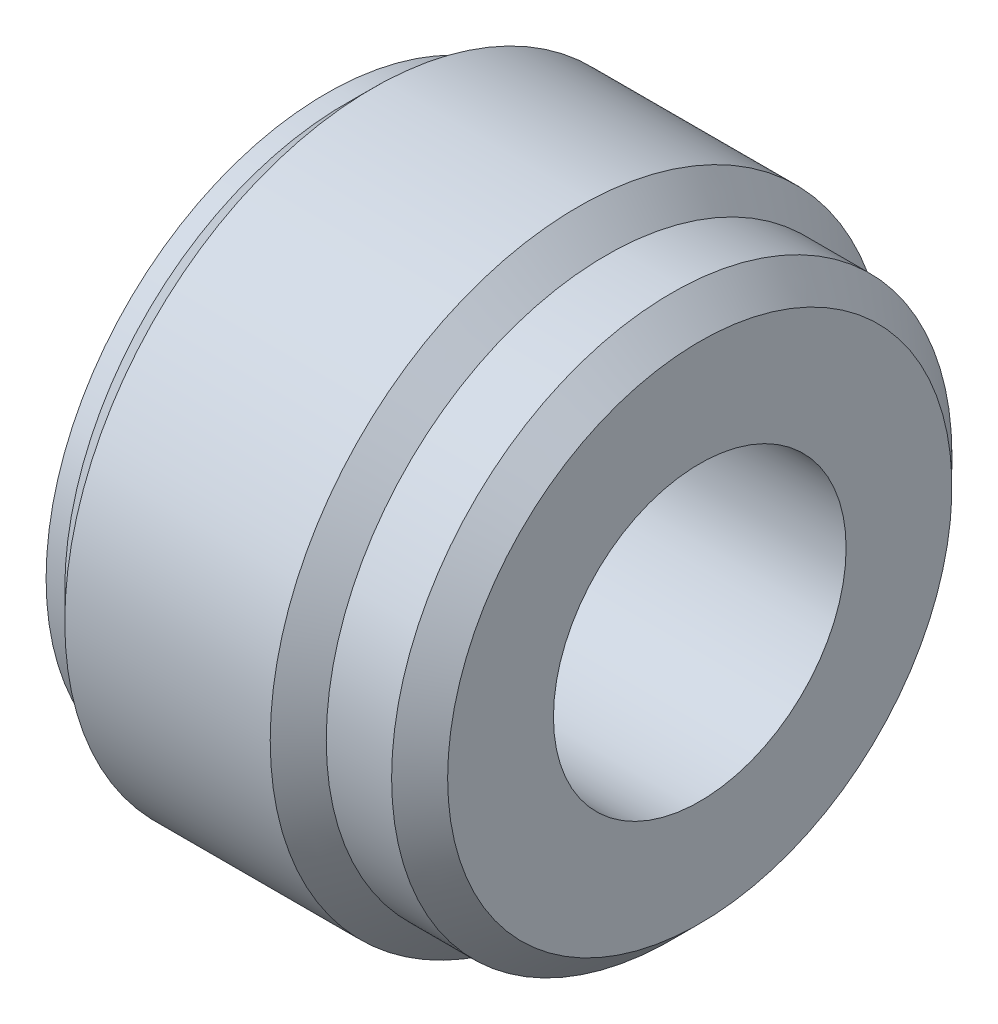
ISO-10303-21;
HEADER;
FILE_DESCRIPTION(('STEP AP214'),'2;1');
FILE_NAME('part.step','',(''),(''),'','','');
FILE_SCHEMA(('AUTOMOTIVE_DESIGN { 1 0 10303 214 1 1 1 1 }'));
ENDSEC;
DATA;
#1=APPLICATION_CONTEXT('core data for automotive mechanical design processes');
#2=APPLICATION_PROTOCOL_DEFINITION('international standard','automotive_design',2000,#1);
#3=PRODUCT_CONTEXT('',#1,'mechanical');
#4=PRODUCT('Part','Part','',(#3));
#5=PRODUCT_RELATED_PRODUCT_CATEGORY('part','',(#4));
#6=PRODUCT_DEFINITION_FORMATION('','',#4);
#7=PRODUCT_DEFINITION_CONTEXT('part definition',#1,'design');
#8=PRODUCT_DEFINITION('design','',#6,#7);
#9=PRODUCT_DEFINITION_SHAPE('','',#8);
#10=(LENGTH_UNIT() NAMED_UNIT(*) SI_UNIT(.MILLI.,.METRE.));
#11=(NAMED_UNIT(*) PLANE_ANGLE_UNIT() SI_UNIT($,.RADIAN.));
#12=(NAMED_UNIT(*) SI_UNIT($,.STERADIAN.) SOLID_ANGLE_UNIT());
#13=UNCERTAINTY_MEASURE_WITH_UNIT(LENGTH_MEASURE(1.E-05),#10,'distance_accuracy_value','');
#14=(GEOMETRIC_REPRESENTATION_CONTEXT(3) GLOBAL_UNCERTAINTY_ASSIGNED_CONTEXT((#13)) GLOBAL_UNIT_ASSIGNED_CONTEXT((#10,
#11,#12)) REPRESENTATION_CONTEXT('',''));
#15=CARTESIAN_POINT('',(0.,0.,0.));
#16=DIRECTION('',(0.,0.,1.));
#17=DIRECTION('',(1.,0.,0.));
#18=AXIS2_PLACEMENT_3D('',#15,#16,#17);
#19=CARTESIAN_POINT('',(0.,0.,0.));
#20=DIRECTION('',(1.,0.,0.));
#21=DIRECTION('',(0.,0.,-1.));
#22=AXIS2_PLACEMENT_3D('',#19,#20,#21);
#23=PLANE('',#22);
#24=CARTESIAN_POINT('',(0.,0.,0.));
#25=DIRECTION('',(-1.,0.,0.));
#26=DIRECTION('',(0.,0.,1.));
#27=AXIS2_PLACEMENT_3D('',#24,#25,#26);
#28=CIRCLE('',#27,0.7835);
#29=CARTESIAN_POINT('',(0.,0.,0.7835));
#30=VERTEX_POINT('',#29);
#31=EDGE_CURVE('E70',#30,#30,#28,.T.);
#32=ORIENTED_EDGE('',*,*,#31,.F.);
#33=EDGE_LOOP('',(#32));
#34=FACE_BOUND('',#33,.T.);
#35=CARTESIAN_POINT('',(0.,0.,0.));
#36=DIRECTION('',(-1.,0.,0.));
#37=DIRECTION('',(0.,0.,1.));
#38=AXIS2_PLACEMENT_3D('',#35,#36,#37);
#39=CIRCLE('',#38,1.5);
#40=CARTESIAN_POINT('',(0.,0.,1.5));
#41=VERTEX_POINT('',#40);
#42=EDGE_CURVE('E58',#41,#41,#39,.T.);
#43=ORIENTED_EDGE('',*,*,#42,.T.);
#44=EDGE_LOOP('',(#43));
#45=FACE_BOUND('',#44,.T.);
#46=ADVANCED_FACE('F38',(#34,#45),#23,.F.);
#47=CARTESIAN_POINT('',(-87.49,0.,0.));
#48=DIRECTION('',(-1.,0.,0.));
#49=DIRECTION('',(0.,0.,1.));
#50=AXIS2_PLACEMENT_3D('',#47,#48,#49);
#51=CYLINDRICAL_SURFACE('',#50,1.5);
#52=ORIENTED_EDGE('',*,*,#42,.F.);
#53=EDGE_LOOP('',(#52));
#54=FACE_BOUND('',#53,.T.);
#55=CARTESIAN_POINT('',(0.100000000000003,0.,0.));
#56=DIRECTION('',(-1.,0.,0.));
#57=DIRECTION('',(0.,0.,1.));
#58=AXIS2_PLACEMENT_3D('',#55,#56,#57);
#59=CIRCLE('',#58,1.5);
#60=CARTESIAN_POINT('',(0.100000000000003,0.,1.5));
#61=VERTEX_POINT('',#60);
#62=EDGE_CURVE('E61',#61,#61,#59,.T.);
#63=ORIENTED_EDGE('',*,*,#62,.T.);
#64=EDGE_LOOP('',(#63));
#65=FACE_BOUND('',#64,.T.);
#66=ADVANCED_FACE('F78',(#54,#65),#51,.T.);
#67=CARTESIAN_POINT('',(-87.49,0.,0.));
#68=DIRECTION('',(-1.,0.,0.));
#69=DIRECTION('',(0.,0.,1.));
#70=AXIS2_PLACEMENT_3D('',#67,#68,#69);
#71=CYLINDRICAL_SURFACE('',#70,1.65);
#72=CARTESIAN_POINT('',(1.35,0.,0.));
#73=DIRECTION('',(-1.,0.,0.));
#74=DIRECTION('',(0.,0.,1.));
#75=AXIS2_PLACEMENT_3D('',#72,#73,#74);
#76=CIRCLE('',#75,1.65);
#77=CARTESIAN_POINT('',(1.35,0.,1.65));
#78=VERTEX_POINT('',#77);
#79=EDGE_CURVE('E10',#78,#78,#76,.T.);
#80=ORIENTED_EDGE('',*,*,#79,.T.);
#81=EDGE_LOOP('',(#80));
#82=FACE_BOUND('',#81,.T.);
#83=CARTESIAN_POINT('',(0.25,0.,0.));
#84=DIRECTION('',(1.,0.,0.));
#85=DIRECTION('',(0.,0.,-1.));
#86=AXIS2_PLACEMENT_3D('',#83,#84,#85);
#87=CIRCLE('',#86,1.65);
#88=CARTESIAN_POINT('',(0.25,0.,-1.65));
#89=VERTEX_POINT('',#88);
#90=EDGE_CURVE('E45',#89,#89,#87,.T.);
#91=ORIENTED_EDGE('',*,*,#90,.T.);
#92=EDGE_LOOP('',(#91));
#93=FACE_BOUND('',#92,.T.);
#94=ADVANCED_FACE('F84',(#82,#93),#71,.T.);
#95=CARTESIAN_POINT('',(-87.49,0.,0.));
#96=DIRECTION('',(-1.,0.,0.));
#97=DIRECTION('',(0.,0.,1.));
#98=AXIS2_PLACEMENT_3D('',#95,#96,#97);
#99=CYLINDRICAL_SURFACE('',#98,1.5);
#100=CARTESIAN_POINT('',(1.85,0.,0.));
#101=DIRECTION('',(-1.,0.,0.));
#102=DIRECTION('',(0.,0.,1.));
#103=AXIS2_PLACEMENT_3D('',#100,#101,#102);
#104=CIRCLE('',#103,1.5);
#105=CARTESIAN_POINT('',(1.85,0.,1.5));
#106=VERTEX_POINT('',#105);
#107=EDGE_CURVE('E53',#106,#106,#104,.T.);
#108=ORIENTED_EDGE('',*,*,#107,.T.);
#109=EDGE_LOOP('',(#108));
#110=FACE_BOUND('',#109,.T.);
#111=CARTESIAN_POINT('',(1.5,0.,0.));
#112=DIRECTION('',(-1.,0.,0.));
#113=DIRECTION('',(0.,0.,1.));
#114=AXIS2_PLACEMENT_3D('',#111,#112,#113);
#115=CIRCLE('',#114,1.5);
#116=CARTESIAN_POINT('',(1.5,0.,1.5));
#117=VERTEX_POINT('',#116);
#118=EDGE_CURVE('E64',#117,#117,#115,.T.);
#119=ORIENTED_EDGE('',*,*,#118,.F.);
#120=EDGE_LOOP('',(#119));
#121=FACE_BOUND('',#120,.T.);
#122=ADVANCED_FACE('F105',(#110,#121),#99,.T.);
#123=CARTESIAN_POINT('',(2.,1.5,0.));
#124=DIRECTION('',(-1.,0.,0.));
#125=DIRECTION('',(0.,0.,1.));
#126=AXIS2_PLACEMENT_3D('',#123,#124,#125);
#127=PLANE('',#126);
#128=CARTESIAN_POINT('',(2.,0.,0.));
#129=DIRECTION('',(-1.,0.,0.));
#130=DIRECTION('',(0.,0.,1.));
#131=AXIS2_PLACEMENT_3D('',#128,#129,#130);
#132=CIRCLE('',#131,1.35);
#133=CARTESIAN_POINT('',(2.,0.,1.35));
#134=VERTEX_POINT('',#133);
#135=EDGE_CURVE('E49',#134,#134,#132,.F.);
#136=ORIENTED_EDGE('',*,*,#135,.T.);
#137=EDGE_LOOP('',(#136));
#138=FACE_BOUND('',#137,.T.);
#139=CARTESIAN_POINT('',(2.,0.,0.));
#140=DIRECTION('',(-1.,0.,0.));
#141=DIRECTION('',(0.,0.,1.));
#142=AXIS2_PLACEMENT_3D('',#139,#140,#141);
#143=CIRCLE('',#142,0.7835);
#144=CARTESIAN_POINT('',(2.,0.,0.7835));
#145=VERTEX_POINT('',#144);
#146=EDGE_CURVE('E67',#145,#145,#143,.T.);
#147=ORIENTED_EDGE('',*,*,#146,.T.);
#148=EDGE_LOOP('',(#147));
#149=FACE_BOUND('',#148,.T.);
#150=ADVANCED_FACE('F108',(#138,#149),#127,.F.);
#151=CARTESIAN_POINT('',(0.,0.,0.));
#152=DIRECTION('',(-1.,0.,0.));
#153=DIRECTION('',(0.,0.,1.));
#154=AXIS2_PLACEMENT_3D('',#151,#152,#153);
#155=CYLINDRICAL_SURFACE('',#154,0.7835);
#156=ORIENTED_EDGE('',*,*,#146,.F.);
#157=EDGE_LOOP('',(#156));
#158=FACE_BOUND('',#157,.T.);
#159=ORIENTED_EDGE('',*,*,#31,.T.);
#160=EDGE_LOOP('',(#159));
#161=FACE_BOUND('',#160,.T.);
#162=ADVANCED_FACE('F74',(#158,#161),#155,.F.);
#163=CARTESIAN_POINT('',(1.85,0.,0.));
#164=DIRECTION('',(-1.,0.,0.));
#165=DIRECTION('',(0.,0.,1.));
#166=AXIS2_PLACEMENT_3D('',#163,#164,#165);
#167=CONICAL_SURFACE('',#166,1.5,0.785398163397461);
#168=ORIENTED_EDGE('',*,*,#135,.F.);
#169=EDGE_LOOP('',(#168));
#170=FACE_BOUND('',#169,.T.);
#171=ORIENTED_EDGE('',*,*,#107,.F.);
#172=EDGE_LOOP('',(#171));
#173=FACE_BOUND('',#172,.T.);
#174=ADVANCED_FACE('F94',(#170,#173),#167,.T.);
#175=CARTESIAN_POINT('',(1.35,0.,0.));
#176=DIRECTION('',(-1.,0.,0.));
#177=DIRECTION('',(0.,0.,1.));
#178=AXIS2_PLACEMENT_3D('',#175,#176,#177);
#179=CONICAL_SURFACE('',#178,1.65,0.78539816339746);
#180=ORIENTED_EDGE('',*,*,#118,.T.);
#181=EDGE_LOOP('',(#180));
#182=FACE_BOUND('',#181,.T.);
#183=ORIENTED_EDGE('',*,*,#79,.F.);
#184=EDGE_LOOP('',(#183));
#185=FACE_BOUND('',#184,.T.);
#186=ADVANCED_FACE('F89',(#182,#185),#179,.T.);
#187=CARTESIAN_POINT('',(0.100000000000003,0.,0.));
#188=DIRECTION('',(1.,0.,0.));
#189=DIRECTION('',(0.,0.,-1.));
#190=AXIS2_PLACEMENT_3D('',#187,#188,#189);
#191=CONICAL_SURFACE('',#190,1.5,0.785398163397473);
#192=ORIENTED_EDGE('',*,*,#90,.F.);
#193=EDGE_LOOP('',(#192));
#194=FACE_BOUND('',#193,.T.);
#195=ORIENTED_EDGE('',*,*,#62,.F.);
#196=EDGE_LOOP('',(#195));
#197=FACE_BOUND('',#196,.T.);
#198=ADVANCED_FACE('F40',(#194,#197),#191,.T.);
#199=CLOSED_SHELL('',(#46,#66,#94,#122,#150,#162,#174,#186,#198));
#200=MANIFOLD_SOLID_BREP('B2',#199);
#201=ADVANCED_BREP_SHAPE_REPRESENTATION('',(#18,#200),#14);
#202=SHAPE_DEFINITION_REPRESENTATION(#9,#201);
ENDSEC;
END-ISO-10303-21;
